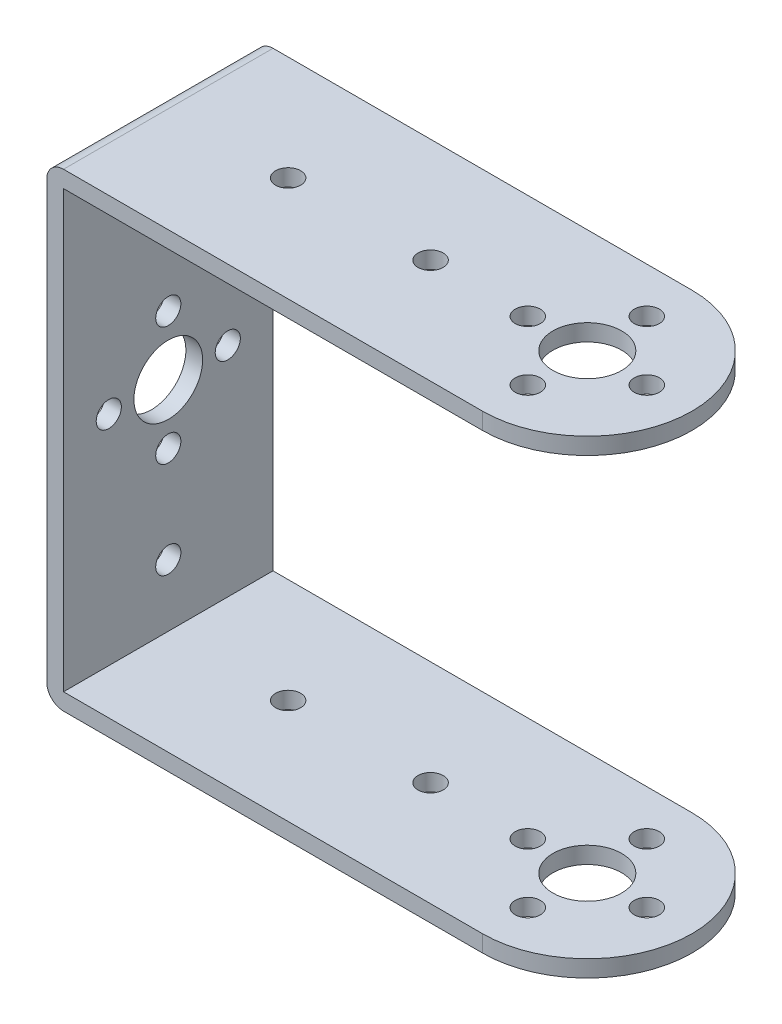
ISO-10303-21;
HEADER;
FILE_DESCRIPTION(('STEP AP214'),'2;1');
FILE_NAME('part.step','',(''),(''),'','','');
FILE_SCHEMA(('AUTOMOTIVE_DESIGN { 1 0 10303 214 1 1 1 1 }'));
ENDSEC;
DATA;
#1=APPLICATION_CONTEXT('core data for automotive mechanical design processes');
#2=APPLICATION_PROTOCOL_DEFINITION('international standard','automotive_design',2000,#1);
#3=PRODUCT_CONTEXT('',#1,'mechanical');
#4=PRODUCT('Part','Part','',(#3));
#5=PRODUCT_RELATED_PRODUCT_CATEGORY('part','',(#4));
#6=PRODUCT_DEFINITION_FORMATION('','',#4);
#7=PRODUCT_DEFINITION_CONTEXT('part definition',#1,'design');
#8=PRODUCT_DEFINITION('design','',#6,#7);
#9=PRODUCT_DEFINITION_SHAPE('','',#8);
#10=(LENGTH_UNIT() NAMED_UNIT(*) SI_UNIT(.MILLI.,.METRE.));
#11=(NAMED_UNIT(*) PLANE_ANGLE_UNIT() SI_UNIT($,.RADIAN.));
#12=(NAMED_UNIT(*) SI_UNIT($,.STERADIAN.) SOLID_ANGLE_UNIT());
#13=UNCERTAINTY_MEASURE_WITH_UNIT(LENGTH_MEASURE(1.E-05),#10,'distance_accuracy_value','');
#14=(GEOMETRIC_REPRESENTATION_CONTEXT(3) GLOBAL_UNCERTAINTY_ASSIGNED_CONTEXT((#13)) GLOBAL_UNIT_ASSIGNED_CONTEXT((#10,
#11,#12)) REPRESENTATION_CONTEXT('',''));
#15=CARTESIAN_POINT('',(0.,0.,0.));
#16=DIRECTION('',(0.,0.,1.));
#17=DIRECTION('',(1.,0.,0.));
#18=AXIS2_PLACEMENT_3D('',#15,#16,#17);
#19=CARTESIAN_POINT('',(-40.5,-56.,-12.5));
#20=DIRECTION('',(1.,0.,0.));
#21=DIRECTION('',(0.,0.,-1.));
#22=AXIS2_PLACEMENT_3D('',#19,#20,#21);
#23=PLANE('',#22);
#24=CARTESIAN_POINT('',(-40.5,-9.4,0.));
#25=DIRECTION('',(1.,0.,0.));
#26=DIRECTION('',(0.,0.,-1.));
#27=AXIS2_PLACEMENT_3D('',#24,#25,#26);
#28=CIRCLE('',#27,1.5);
#29=CARTESIAN_POINT('',(-40.5,-9.4,-1.5));
#30=VERTEX_POINT('',#29);
#31=EDGE_CURVE('E132',#30,#30,#28,.F.);
#32=ORIENTED_EDGE('',*,*,#31,.T.);
#33=EDGE_LOOP('',(#32));
#34=FACE_BOUND('',#33,.T.);
#35=CARTESIAN_POINT('',(-40.5,-35.1,0.));
#36=DIRECTION('',(1.,0.,0.));
#37=DIRECTION('',(0.,0.,-1.));
#38=AXIS2_PLACEMENT_3D('',#35,#36,#37);
#39=CIRCLE('',#38,1.50000000000002);
#40=CARTESIAN_POINT('',(-40.5,-35.1,-1.50000000000001));
#41=VERTEX_POINT('',#40);
#42=EDGE_CURVE('E158',#41,#41,#39,.F.);
#43=ORIENTED_EDGE('',*,*,#42,.T.);
#44=EDGE_LOOP('',(#43));
#45=FACE_BOUND('',#44,.T.);
#46=CARTESIAN_POINT('',(-40.5,-28.,7.1));
#47=DIRECTION('',(1.,0.,0.));
#48=DIRECTION('',(0.,0.,-1.));
#49=AXIS2_PLACEMENT_3D('',#46,#47,#48);
#50=CIRCLE('',#49,1.5);
#51=CARTESIAN_POINT('',(-40.5,-28.,5.6));
#52=VERTEX_POINT('',#51);
#53=EDGE_CURVE('E152',#52,#52,#50,.F.);
#54=ORIENTED_EDGE('',*,*,#53,.T.);
#55=EDGE_LOOP('',(#54));
#56=FACE_BOUND('',#55,.T.);
#57=CARTESIAN_POINT('',(-40.5,-20.9,0.));
#58=DIRECTION('',(1.,0.,0.));
#59=DIRECTION('',(0.,0.,-1.));
#60=AXIS2_PLACEMENT_3D('',#57,#58,#59);
#61=CIRCLE('',#60,1.50000000000001);
#62=CARTESIAN_POINT('',(-40.5,-20.9,-1.50000000000001));
#63=VERTEX_POINT('',#62);
#64=EDGE_CURVE('E151',#63,#63,#61,.F.);
#65=ORIENTED_EDGE('',*,*,#64,.T.);
#66=EDGE_LOOP('',(#65));
#67=FACE_BOUND('',#66,.T.);
#68=CARTESIAN_POINT('',(-40.5,-46.6,0.));
#69=DIRECTION('',(1.,0.,0.));
#70=DIRECTION('',(0.,0.,-1.));
#71=AXIS2_PLACEMENT_3D('',#68,#69,#70);
#72=CIRCLE('',#71,1.5);
#73=CARTESIAN_POINT('',(-40.5,-46.6,-1.50000000000001));
#74=VERTEX_POINT('',#73);
#75=EDGE_CURVE('E176',#74,#74,#72,.F.);
#76=ORIENTED_EDGE('',*,*,#75,.T.);
#77=EDGE_LOOP('',(#76));
#78=FACE_BOUND('',#77,.T.);
#79=CARTESIAN_POINT('',(-40.5,-28.,-7.1));
#80=DIRECTION('',(1.,0.,0.));
#81=DIRECTION('',(0.,0.,-1.));
#82=AXIS2_PLACEMENT_3D('',#79,#80,#81);
#83=CIRCLE('',#82,1.5);
#84=CARTESIAN_POINT('',(-40.5,-28.,-8.6));
#85=VERTEX_POINT('',#84);
#86=EDGE_CURVE('E170',#85,#85,#83,.F.);
#87=ORIENTED_EDGE('',*,*,#86,.T.);
#88=EDGE_LOOP('',(#87));
#89=FACE_BOUND('',#88,.T.);
#90=CARTESIAN_POINT('',(-40.5,-28.,0.));
#91=DIRECTION('',(1.,0.,0.));
#92=DIRECTION('',(0.,0.,-1.));
#93=AXIS2_PLACEMENT_3D('',#90,#91,#92);
#94=CIRCLE('',#93,4.1);
#95=CARTESIAN_POINT('',(-40.5,-28.,-4.1));
#96=VERTEX_POINT('',#95);
#97=EDGE_CURVE('E169',#96,#96,#94,.F.);
#98=ORIENTED_EDGE('',*,*,#97,.T.);
#99=EDGE_LOOP('',(#98));
#100=FACE_BOUND('',#99,.T.);
#101=DIRECTION('',(0.,1.,0.));
#102=VECTOR('',#101,1.);
#103=CARTESIAN_POINT('',(-40.5,-56.,12.5));
#104=LINE('',#103,#102);
#105=CARTESIAN_POINT('',(-40.5,-54.,12.5));
#106=VERTEX_POINT('',#105);
#107=CARTESIAN_POINT('',(-40.5,-2.,12.5));
#108=VERTEX_POINT('',#107);
#109=EDGE_CURVE('E189',#106,#108,#104,.T.);
#110=ORIENTED_EDGE('',*,*,#109,.F.);
#111=DIRECTION('',(0.,0.,-1.));
#112=VECTOR('',#111,1.);
#113=CARTESIAN_POINT('',(-40.5,-54.,0.));
#114=LINE('',#113,#112);
#115=CARTESIAN_POINT('',(-40.5,-54.,-12.5));
#116=VERTEX_POINT('',#115);
#117=EDGE_CURVE('E682',#106,#116,#114,.T.);
#118=ORIENTED_EDGE('',*,*,#117,.T.);
#119=DIRECTION('',(0.,1.,0.));
#120=VECTOR('',#119,1.);
#121=CARTESIAN_POINT('',(-40.5,-56.,-12.5));
#122=LINE('',#121,#120);
#123=CARTESIAN_POINT('',(-40.5,-2.,-12.5));
#124=VERTEX_POINT('',#123);
#125=EDGE_CURVE('E190',#116,#124,#122,.T.);
#126=ORIENTED_EDGE('',*,*,#125,.T.);
#127=DIRECTION('',(0.,0.,-1.));
#128=VECTOR('',#127,1.);
#129=CARTESIAN_POINT('',(-40.5,-2.,0.));
#130=LINE('',#129,#128);
#131=EDGE_CURVE('E192',#108,#124,#130,.T.);
#132=ORIENTED_EDGE('',*,*,#131,.F.);
#133=EDGE_LOOP('',(#110,#118,#126,#132));
#134=FACE_BOUND('',#133,.T.);
#135=ADVANCED_FACE('F37',(#34,#45,#56,#67,#78,#89,#100,#134),#23,.T.);
#136=CARTESIAN_POINT('',(9.5,-2.,0.));
#137=DIRECTION('',(0.,1.,0.));
#138=DIRECTION('',(0.,0.,1.));
#139=AXIS2_PLACEMENT_3D('',#136,#137,#138);
#140=CYLINDRICAL_SURFACE('',#139,12.5);
#141=DIRECTION('',(0.,1.,0.));
#142=VECTOR('',#141,1.);
#143=CARTESIAN_POINT('',(9.5,-2.,12.5));
#144=LINE('',#143,#142);
#145=CARTESIAN_POINT('',(9.5,-2.,12.5));
#146=VERTEX_POINT('',#145);
#147=CARTESIAN_POINT('',(9.5,0.,12.5));
#148=VERTEX_POINT('',#147);
#149=EDGE_CURVE('E251',#146,#148,#144,.T.);
#150=ORIENTED_EDGE('',*,*,#149,.F.);
#151=CARTESIAN_POINT('',(9.5,-2.,0.));
#152=DIRECTION('',(0.,1.,0.));
#153=DIRECTION('',(0.,0.,1.));
#154=AXIS2_PLACEMENT_3D('',#151,#152,#153);
#155=CIRCLE('',#154,12.5);
#156=CARTESIAN_POINT('',(9.49999999999999,-2.,-12.5));
#157=VERTEX_POINT('',#156);
#158=EDGE_CURVE('E259',#157,#146,#155,.F.);
#159=ORIENTED_EDGE('',*,*,#158,.F.);
#160=DIRECTION('',(0.,1.,0.));
#161=VECTOR('',#160,1.);
#162=CARTESIAN_POINT('',(9.5,-2.,-12.5));
#163=LINE('',#162,#161);
#164=CARTESIAN_POINT('',(9.49999999999999,0.,-12.5));
#165=VERTEX_POINT('',#164);
#166=EDGE_CURVE('E256',#165,#157,#163,.F.);
#167=ORIENTED_EDGE('',*,*,#166,.F.);
#168=CARTESIAN_POINT('',(9.5,0.,0.));
#169=DIRECTION('',(0.,1.,0.));
#170=DIRECTION('',(0.,0.,1.));
#171=AXIS2_PLACEMENT_3D('',#168,#169,#170);
#172=CIRCLE('',#171,12.5);
#173=EDGE_CURVE('E262',#148,#165,#172,.T.);
#174=ORIENTED_EDGE('',*,*,#173,.F.);
#175=EDGE_LOOP('',(#150,#159,#167,#174));
#176=FACE_BOUND('',#175,.T.);
#177=ADVANCED_FACE('F294',(#176),#140,.T.);
#178=CARTESIAN_POINT('',(22.,-2.,-12.5));
#179=DIRECTION('',(0.,0.,-1.));
#180=DIRECTION('',(-1.,0.,0.));
#181=AXIS2_PLACEMENT_3D('',#178,#179,#180);
#182=PLANE('',#181);
#183=DIRECTION('',(-1.,0.,0.));
#184=VECTOR('',#183,1.);
#185=CARTESIAN_POINT('',(-42.5,-56.,-12.5));
#186=LINE('',#185,#184);
#187=CARTESIAN_POINT('',(9.49999999999999,-56.,-12.5));
#188=VERTEX_POINT('',#187);
#189=CARTESIAN_POINT('',(-40.5,-56.,-12.5));
#190=VERTEX_POINT('',#189);
#191=EDGE_CURVE('E122',#188,#190,#186,.T.);
#192=ORIENTED_EDGE('',*,*,#191,.T.);
#193=CARTESIAN_POINT('',(-40.5,-54.,-12.5));
#194=DIRECTION('',(0.,0.,-1.));
#195=DIRECTION('',(-1.,0.,0.));
#196=AXIS2_PLACEMENT_3D('',#193,#194,#195);
#197=CIRCLE('',#196,2.);
#198=CARTESIAN_POINT('',(-42.5,-54.,-12.5));
#199=VERTEX_POINT('',#198);
#200=EDGE_CURVE('E45',#190,#199,#197,.T.);
#201=ORIENTED_EDGE('',*,*,#200,.T.);
#202=DIRECTION('',(0.,-1.,0.));
#203=VECTOR('',#202,1.);
#204=CARTESIAN_POINT('',(-42.5,0.,-12.5));
#205=LINE('',#204,#203);
#206=CARTESIAN_POINT('',(-42.5,-2.,-12.5));
#207=VERTEX_POINT('',#206);
#208=EDGE_CURVE('E205',#207,#199,#205,.T.);
#209=ORIENTED_EDGE('',*,*,#208,.F.);
#210=CARTESIAN_POINT('',(-40.5,-2.,-12.5));
#211=DIRECTION('',(0.,0.,-1.));
#212=DIRECTION('',(-1.,0.,0.));
#213=AXIS2_PLACEMENT_3D('',#210,#211,#212);
#214=CIRCLE('',#213,2.);
#215=CARTESIAN_POINT('',(-40.5,0.,-12.5));
#216=VERTEX_POINT('',#215);
#217=EDGE_CURVE('E52',#207,#216,#214,.T.);
#218=ORIENTED_EDGE('',*,*,#217,.T.);
#219=DIRECTION('',(-1.,0.,0.));
#220=VECTOR('',#219,1.);
#221=CARTESIAN_POINT('',(22.,0.,-12.5));
#222=LINE('',#221,#220);
#223=EDGE_CURVE('E248',#165,#216,#222,.T.);
#224=ORIENTED_EDGE('',*,*,#223,.F.);
#225=ORIENTED_EDGE('',*,*,#166,.T.);
#226=DIRECTION('',(-1.,0.,0.));
#227=VECTOR('',#226,1.);
#228=CARTESIAN_POINT('',(22.,-2.,-12.5));
#229=LINE('',#228,#227);
#230=EDGE_CURVE('E247',#157,#124,#229,.T.);
#231=ORIENTED_EDGE('',*,*,#230,.T.);
#232=ORIENTED_EDGE('',*,*,#125,.F.);
#233=DIRECTION('',(-1.,0.,0.));
#234=VECTOR('',#233,1.);
#235=CARTESIAN_POINT('',(22.,-54.,-12.5));
#236=LINE('',#235,#234);
#237=CARTESIAN_POINT('',(9.49999999999999,-54.,-12.5));
#238=VERTEX_POINT('',#237);
#239=EDGE_CURVE('E139',#238,#116,#236,.T.);
#240=ORIENTED_EDGE('',*,*,#239,.F.);
#241=DIRECTION('',(0.,-1.,0.));
#242=VECTOR('',#241,1.);
#243=CARTESIAN_POINT('',(9.5,-54.,-12.5));
#244=LINE('',#243,#242);
#245=EDGE_CURVE('E138',#188,#238,#244,.F.);
#246=ORIENTED_EDGE('',*,*,#245,.F.);
#247=EDGE_LOOP('',(#192,#201,#209,#218,#224,#225,#231,#232,#240,#246));
#248=FACE_BOUND('',#247,.T.);
#249=ADVANCED_FACE('F275',(#248),#182,.T.);
#250=CARTESIAN_POINT('',(22.,-2.,12.5));
#251=DIRECTION('',(0.,0.,1.));
#252=DIRECTION('',(1.,0.,0.));
#253=AXIS2_PLACEMENT_3D('',#250,#251,#252);
#254=PLANE('',#253);
#255=DIRECTION('',(0.,1.,0.));
#256=VECTOR('',#255,1.);
#257=CARTESIAN_POINT('',(-42.5,-2.,12.5));
#258=LINE('',#257,#256);
#259=CARTESIAN_POINT('',(-42.5,-54.,12.5));
#260=VERTEX_POINT('',#259);
#261=CARTESIAN_POINT('',(-42.5,-2.,12.5));
#262=VERTEX_POINT('',#261);
#263=EDGE_CURVE('E202',#260,#262,#258,.T.);
#264=ORIENTED_EDGE('',*,*,#263,.F.);
#265=CARTESIAN_POINT('',(-40.5,-54.,12.5));
#266=DIRECTION('',(0.,0.,1.));
#267=DIRECTION('',(1.,0.,0.));
#268=AXIS2_PLACEMENT_3D('',#265,#266,#267);
#269=CIRCLE('',#268,2.);
#270=CARTESIAN_POINT('',(-40.5,-56.,12.5));
#271=VERTEX_POINT('',#270);
#272=EDGE_CURVE('E121',#260,#271,#269,.T.);
#273=ORIENTED_EDGE('',*,*,#272,.T.);
#274=DIRECTION('',(1.,0.,0.));
#275=VECTOR('',#274,1.);
#276=CARTESIAN_POINT('',(-42.5,-56.,12.5));
#277=LINE('',#276,#275);
#278=CARTESIAN_POINT('',(9.5,-56.,12.5));
#279=VERTEX_POINT('',#278);
#280=EDGE_CURVE('E114',#271,#279,#277,.T.);
#281=ORIENTED_EDGE('',*,*,#280,.T.);
#282=DIRECTION('',(0.,-1.,0.));
#283=VECTOR('',#282,1.);
#284=CARTESIAN_POINT('',(9.5,-54.,12.5));
#285=LINE('',#284,#283);
#286=CARTESIAN_POINT('',(9.5,-54.,12.5));
#287=VERTEX_POINT('',#286);
#288=EDGE_CURVE('E120',#287,#279,#285,.T.);
#289=ORIENTED_EDGE('',*,*,#288,.F.);
#290=DIRECTION('',(1.,0.,0.));
#291=VECTOR('',#290,1.);
#292=CARTESIAN_POINT('',(22.,-54.,12.5));
#293=LINE('',#292,#291);
#294=EDGE_CURVE('E143',#106,#287,#293,.T.);
#295=ORIENTED_EDGE('',*,*,#294,.F.);
#296=ORIENTED_EDGE('',*,*,#109,.T.);
#297=DIRECTION('',(1.,0.,0.));
#298=VECTOR('',#297,1.);
#299=CARTESIAN_POINT('',(22.,-2.,12.5));
#300=LINE('',#299,#298);
#301=EDGE_CURVE('E245',#108,#146,#300,.T.);
#302=ORIENTED_EDGE('',*,*,#301,.T.);
#303=ORIENTED_EDGE('',*,*,#149,.T.);
#304=DIRECTION('',(1.,0.,0.));
#305=VECTOR('',#304,1.);
#306=CARTESIAN_POINT('',(22.,0.,12.5));
#307=LINE('',#306,#305);
#308=CARTESIAN_POINT('',(-40.5,0.,12.5));
#309=VERTEX_POINT('',#308);
#310=EDGE_CURVE('E244',#309,#148,#307,.T.);
#311=ORIENTED_EDGE('',*,*,#310,.F.);
#312=CARTESIAN_POINT('',(-40.5,-2.,12.5));
#313=DIRECTION('',(0.,0.,1.));
#314=DIRECTION('',(1.,0.,0.));
#315=AXIS2_PLACEMENT_3D('',#312,#313,#314);
#316=CIRCLE('',#315,2.);
#317=EDGE_CURVE('E270',#309,#262,#316,.T.);
#318=ORIENTED_EDGE('',*,*,#317,.T.);
#319=EDGE_LOOP('',(#264,#273,#281,#289,#295,#296,#302,#303,#311,#318));
#320=FACE_BOUND('',#319,.T.);
#321=ADVANCED_FACE('F117',(#320),#254,.T.);
#322=CARTESIAN_POINT('',(0.,-2.,0.));
#323=DIRECTION('',(0.,1.,0.));
#324=DIRECTION('',(0.,0.,1.));
#325=AXIS2_PLACEMENT_3D('',#322,#323,#324);
#326=PLANE('',#325);
#327=CARTESIAN_POINT('',(-26.2,-2.,0.));
#328=DIRECTION('',(0.,1.,0.));
#329=DIRECTION('',(0.,0.,1.));
#330=AXIS2_PLACEMENT_3D('',#327,#328,#329);
#331=CIRCLE('',#330,1.5);
#332=CARTESIAN_POINT('',(-26.2,-2.,1.5));
#333=VERTEX_POINT('',#332);
#334=EDGE_CURVE('E199',#333,#333,#331,.F.);
#335=ORIENTED_EDGE('',*,*,#334,.F.);
#336=EDGE_LOOP('',(#335));
#337=FACE_BOUND('',#336,.T.);
#338=CARTESIAN_POINT('',(-9.2,-2.,0.));
#339=DIRECTION('',(0.,1.,0.));
#340=DIRECTION('',(0.,0.,1.));
#341=AXIS2_PLACEMENT_3D('',#338,#339,#340);
#342=CIRCLE('',#341,1.5);
#343=CARTESIAN_POINT('',(-9.2,-2.,1.5));
#344=VERTEX_POINT('',#343);
#345=EDGE_CURVE('E220',#344,#344,#342,.F.);
#346=ORIENTED_EDGE('',*,*,#345,.F.);
#347=EDGE_LOOP('',(#346));
#348=FACE_BOUND('',#347,.T.);
#349=CARTESIAN_POINT('',(9.5,-2.,7.1));
#350=DIRECTION('',(0.,1.,0.));
#351=DIRECTION('',(0.,0.,1.));
#352=AXIS2_PLACEMENT_3D('',#349,#350,#351);
#353=CIRCLE('',#352,1.5);
#354=CARTESIAN_POINT('',(9.5,-2.,8.6));
#355=VERTEX_POINT('',#354);
#356=EDGE_CURVE('E213',#355,#355,#353,.F.);
#357=ORIENTED_EDGE('',*,*,#356,.F.);
#358=EDGE_LOOP('',(#357));
#359=FACE_BOUND('',#358,.T.);
#360=CARTESIAN_POINT('',(16.6,-2.,0.));
#361=DIRECTION('',(0.,1.,0.));
#362=DIRECTION('',(0.,0.,1.));
#363=AXIS2_PLACEMENT_3D('',#360,#361,#362);
#364=CIRCLE('',#363,1.5);
#365=CARTESIAN_POINT('',(16.6,-2.,1.5));
#366=VERTEX_POINT('',#365);
#367=EDGE_CURVE('E212',#366,#366,#364,.F.);
#368=ORIENTED_EDGE('',*,*,#367,.F.);
#369=EDGE_LOOP('',(#368));
#370=FACE_BOUND('',#369,.T.);
#371=CARTESIAN_POINT('',(9.5,-2.,-7.1));
#372=DIRECTION('',(0.,1.,0.));
#373=DIRECTION('',(0.,0.,1.));
#374=AXIS2_PLACEMENT_3D('',#371,#372,#373);
#375=CIRCLE('',#374,1.5);
#376=CARTESIAN_POINT('',(9.5,-2.,-5.6));
#377=VERTEX_POINT('',#376);
#378=EDGE_CURVE('E231',#377,#377,#375,.F.);
#379=ORIENTED_EDGE('',*,*,#378,.F.);
#380=EDGE_LOOP('',(#379));
#381=FACE_BOUND('',#380,.T.);
#382=CARTESIAN_POINT('',(2.4,-2.,0.));
#383=DIRECTION('',(0.,1.,0.));
#384=DIRECTION('',(0.,0.,1.));
#385=AXIS2_PLACEMENT_3D('',#382,#383,#384);
#386=CIRCLE('',#385,1.5);
#387=CARTESIAN_POINT('',(2.4,-2.,1.5));
#388=VERTEX_POINT('',#387);
#389=EDGE_CURVE('E230',#388,#388,#386,.F.);
#390=ORIENTED_EDGE('',*,*,#389,.F.);
#391=EDGE_LOOP('',(#390));
#392=FACE_BOUND('',#391,.T.);
#393=CARTESIAN_POINT('',(9.5,-2.,0.));
#394=DIRECTION('',(0.,1.,0.));
#395=DIRECTION('',(0.,0.,1.));
#396=AXIS2_PLACEMENT_3D('',#393,#394,#395);
#397=CIRCLE('',#396,4.1);
#398=CARTESIAN_POINT('',(9.5,-2.,4.1));
#399=VERTEX_POINT('',#398);
#400=EDGE_CURVE('E241',#399,#399,#397,.F.);
#401=ORIENTED_EDGE('',*,*,#400,.F.);
#402=EDGE_LOOP('',(#401));
#403=FACE_BOUND('',#402,.T.);
#404=ORIENTED_EDGE('',*,*,#301,.F.);
#405=ORIENTED_EDGE('',*,*,#131,.T.);
#406=ORIENTED_EDGE('',*,*,#230,.F.);
#407=ORIENTED_EDGE('',*,*,#158,.T.);
#408=EDGE_LOOP('',(#404,#405,#406,#407));
#409=FACE_BOUND('',#408,.T.);
#410=ADVANCED_FACE('F337',(#337,#348,#359,#370,#381,#392,#403,#409),#326,.F.);
#411=CARTESIAN_POINT('',(0.,0.,0.));
#412=DIRECTION('',(0.,1.,0.));
#413=DIRECTION('',(0.,0.,1.));
#414=AXIS2_PLACEMENT_3D('',#411,#412,#413);
#415=PLANE('',#414);
#416=ORIENTED_EDGE('',*,*,#223,.T.);
#417=DIRECTION('',(0.,0.,-1.));
#418=VECTOR('',#417,1.);
#419=CARTESIAN_POINT('',(-40.5,0.,0.));
#420=LINE('',#419,#418);
#421=EDGE_CURVE('E11',#216,#309,#420,.F.);
#422=ORIENTED_EDGE('',*,*,#421,.T.);
#423=ORIENTED_EDGE('',*,*,#310,.T.);
#424=ORIENTED_EDGE('',*,*,#173,.T.);
#425=EDGE_LOOP('',(#416,#422,#423,#424));
#426=FACE_BOUND('',#425,.T.);
#427=CARTESIAN_POINT('',(-26.2,0.,0.));
#428=DIRECTION('',(0.,1.,0.));
#429=DIRECTION('',(0.,0.,1.));
#430=AXIS2_PLACEMENT_3D('',#427,#428,#429);
#431=CIRCLE('',#430,1.5);
#432=CARTESIAN_POINT('',(-26.2,0.,1.5));
#433=VERTEX_POINT('',#432);
#434=EDGE_CURVE('E196',#433,#433,#431,.T.);
#435=ORIENTED_EDGE('',*,*,#434,.F.);
#436=EDGE_LOOP('',(#435));
#437=FACE_BOUND('',#436,.T.);
#438=CARTESIAN_POINT('',(-9.2,0.,0.));
#439=DIRECTION('',(0.,1.,0.));
#440=DIRECTION('',(0.,0.,1.));
#441=AXIS2_PLACEMENT_3D('',#438,#439,#440);
#442=CIRCLE('',#441,1.5);
#443=CARTESIAN_POINT('',(-9.2,0.,1.5));
#444=VERTEX_POINT('',#443);
#445=EDGE_CURVE('E208',#444,#444,#442,.T.);
#446=ORIENTED_EDGE('',*,*,#445,.F.);
#447=EDGE_LOOP('',(#446));
#448=FACE_BOUND('',#447,.T.);
#449=CARTESIAN_POINT('',(9.5,0.,7.1));
#450=DIRECTION('',(0.,1.,0.));
#451=DIRECTION('',(0.,0.,1.));
#452=AXIS2_PLACEMENT_3D('',#449,#450,#451);
#453=CIRCLE('',#452,1.5);
#454=CARTESIAN_POINT('',(9.5,0.,8.6));
#455=VERTEX_POINT('',#454);
#456=EDGE_CURVE('E217',#455,#455,#453,.T.);
#457=ORIENTED_EDGE('',*,*,#456,.F.);
#458=EDGE_LOOP('',(#457));
#459=FACE_BOUND('',#458,.T.);
#460=CARTESIAN_POINT('',(16.6,0.,0.));
#461=DIRECTION('',(0.,1.,0.));
#462=DIRECTION('',(0.,0.,1.));
#463=AXIS2_PLACEMENT_3D('',#460,#461,#462);
#464=CIRCLE('',#463,1.5);
#465=CARTESIAN_POINT('',(16.6,0.,1.5));
#466=VERTEX_POINT('',#465);
#467=EDGE_CURVE('E209',#466,#466,#464,.T.);
#468=ORIENTED_EDGE('',*,*,#467,.F.);
#469=EDGE_LOOP('',(#468));
#470=FACE_BOUND('',#469,.T.);
#471=CARTESIAN_POINT('',(9.5,0.,-7.1));
#472=DIRECTION('',(0.,1.,0.));
#473=DIRECTION('',(0.,0.,1.));
#474=AXIS2_PLACEMENT_3D('',#471,#472,#473);
#475=CIRCLE('',#474,1.5);
#476=CARTESIAN_POINT('',(9.5,0.,-5.6));
#477=VERTEX_POINT('',#476);
#478=EDGE_CURVE('E216',#477,#477,#475,.T.);
#479=ORIENTED_EDGE('',*,*,#478,.F.);
#480=EDGE_LOOP('',(#479));
#481=FACE_BOUND('',#480,.T.);
#482=CARTESIAN_POINT('',(2.4,0.,0.));
#483=DIRECTION('',(0.,1.,0.));
#484=DIRECTION('',(0.,0.,1.));
#485=AXIS2_PLACEMENT_3D('',#482,#483,#484);
#486=CIRCLE('',#485,1.5);
#487=CARTESIAN_POINT('',(2.4,0.,1.5));
#488=VERTEX_POINT('',#487);
#489=EDGE_CURVE('E227',#488,#488,#486,.T.);
#490=ORIENTED_EDGE('',*,*,#489,.F.);
#491=EDGE_LOOP('',(#490));
#492=FACE_BOUND('',#491,.T.);
#493=CARTESIAN_POINT('',(9.5,0.,0.));
#494=DIRECTION('',(0.,1.,0.));
#495=DIRECTION('',(0.,0.,1.));
#496=AXIS2_PLACEMENT_3D('',#493,#494,#495);
#497=CIRCLE('',#496,4.1);
#498=CARTESIAN_POINT('',(9.5,0.,4.1));
#499=VERTEX_POINT('',#498);
#500=EDGE_CURVE('E234',#499,#499,#497,.T.);
#501=ORIENTED_EDGE('',*,*,#500,.F.);
#502=EDGE_LOOP('',(#501));
#503=FACE_BOUND('',#502,.T.);
#504=ADVANCED_FACE('F335',(#426,#437,#448,#459,#470,#481,#492,#503),#415,.T.);
#505=CARTESIAN_POINT('',(9.5,-2.001,0.));
#506=DIRECTION('',(0.,1.,0.));
#507=DIRECTION('',(0.,0.,1.));
#508=AXIS2_PLACEMENT_3D('',#505,#506,#507);
#509=CYLINDRICAL_SURFACE('',#508,4.1);
#510=ORIENTED_EDGE('',*,*,#500,.T.);
#511=EDGE_LOOP('',(#510));
#512=FACE_BOUND('',#511,.T.);
#513=ORIENTED_EDGE('',*,*,#400,.T.);
#514=EDGE_LOOP('',(#513));
#515=FACE_BOUND('',#514,.T.);
#516=ADVANCED_FACE('F328',(#512,#515),#509,.F.);
#517=CARTESIAN_POINT('',(2.4,-2.001,0.));
#518=DIRECTION('',(0.,1.,0.));
#519=DIRECTION('',(0.,0.,1.));
#520=AXIS2_PLACEMENT_3D('',#517,#518,#519);
#521=CYLINDRICAL_SURFACE('',#520,1.5);
#522=ORIENTED_EDGE('',*,*,#489,.T.);
#523=EDGE_LOOP('',(#522));
#524=FACE_BOUND('',#523,.T.);
#525=ORIENTED_EDGE('',*,*,#389,.T.);
#526=EDGE_LOOP('',(#525));
#527=FACE_BOUND('',#526,.T.);
#528=ADVANCED_FACE('F325',(#524,#527),#521,.F.);
#529=CARTESIAN_POINT('',(9.5,-2.001,-7.1));
#530=DIRECTION('',(0.,1.,0.));
#531=DIRECTION('',(0.,0.,1.));
#532=AXIS2_PLACEMENT_3D('',#529,#530,#531);
#533=CYLINDRICAL_SURFACE('',#532,1.5);
#534=ORIENTED_EDGE('',*,*,#478,.T.);
#535=EDGE_LOOP('',(#534));
#536=FACE_BOUND('',#535,.T.);
#537=ORIENTED_EDGE('',*,*,#378,.T.);
#538=EDGE_LOOP('',(#537));
#539=FACE_BOUND('',#538,.T.);
#540=ADVANCED_FACE('F317',(#536,#539),#533,.F.);
#541=CARTESIAN_POINT('',(16.6,-2.001,0.));
#542=DIRECTION('',(0.,1.,0.));
#543=DIRECTION('',(0.,0.,1.));
#544=AXIS2_PLACEMENT_3D('',#541,#542,#543);
#545=CYLINDRICAL_SURFACE('',#544,1.5);
#546=ORIENTED_EDGE('',*,*,#467,.T.);
#547=EDGE_LOOP('',(#546));
#548=FACE_BOUND('',#547,.T.);
#549=ORIENTED_EDGE('',*,*,#367,.T.);
#550=EDGE_LOOP('',(#549));
#551=FACE_BOUND('',#550,.T.);
#552=ADVANCED_FACE('F313',(#548,#551),#545,.F.);
#553=CARTESIAN_POINT('',(9.5,-2.001,7.1));
#554=DIRECTION('',(0.,1.,0.));
#555=DIRECTION('',(0.,0.,1.));
#556=AXIS2_PLACEMENT_3D('',#553,#554,#555);
#557=CYLINDRICAL_SURFACE('',#556,1.5);
#558=ORIENTED_EDGE('',*,*,#456,.T.);
#559=EDGE_LOOP('',(#558));
#560=FACE_BOUND('',#559,.T.);
#561=ORIENTED_EDGE('',*,*,#356,.T.);
#562=EDGE_LOOP('',(#561));
#563=FACE_BOUND('',#562,.T.);
#564=ADVANCED_FACE('F316',(#560,#563),#557,.F.);
#565=CARTESIAN_POINT('',(-9.2,-2.001,0.));
#566=DIRECTION('',(0.,1.,0.));
#567=DIRECTION('',(0.,0.,1.));
#568=AXIS2_PLACEMENT_3D('',#565,#566,#567);
#569=CYLINDRICAL_SURFACE('',#568,1.5);
#570=ORIENTED_EDGE('',*,*,#445,.T.);
#571=EDGE_LOOP('',(#570));
#572=FACE_BOUND('',#571,.T.);
#573=ORIENTED_EDGE('',*,*,#345,.T.);
#574=EDGE_LOOP('',(#573));
#575=FACE_BOUND('',#574,.T.);
#576=ADVANCED_FACE('F311',(#572,#575),#569,.F.);
#577=CARTESIAN_POINT('',(-42.5,0.,0.));
#578=DIRECTION('',(-1.,0.,0.));
#579=DIRECTION('',(0.,0.,1.));
#580=AXIS2_PLACEMENT_3D('',#577,#578,#579);
#581=PLANE('',#580);
#582=CARTESIAN_POINT('',(-42.5,-9.4,0.));
#583=DIRECTION('',(-1.,0.,0.));
#584=DIRECTION('',(0.,0.,1.));
#585=AXIS2_PLACEMENT_3D('',#582,#583,#584);
#586=CIRCLE('',#585,1.5);
#587=CARTESIAN_POINT('',(-42.5,-9.4,1.5));
#588=VERTEX_POINT('',#587);
#589=EDGE_CURVE('E161',#588,#588,#586,.T.);
#590=ORIENTED_EDGE('',*,*,#589,.F.);
#591=EDGE_LOOP('',(#590));
#592=FACE_BOUND('',#591,.T.);
#593=CARTESIAN_POINT('',(-42.5,-35.1,0.));
#594=DIRECTION('',(-1.,0.,0.));
#595=DIRECTION('',(0.,0.,1.));
#596=AXIS2_PLACEMENT_3D('',#593,#594,#595);
#597=CIRCLE('',#596,1.50000000000002);
#598=CARTESIAN_POINT('',(-42.5,-35.1,1.50000000000002));
#599=VERTEX_POINT('',#598);
#600=EDGE_CURVE('E155',#599,#599,#597,.T.);
#601=ORIENTED_EDGE('',*,*,#600,.F.);
#602=EDGE_LOOP('',(#601));
#603=FACE_BOUND('',#602,.T.);
#604=CARTESIAN_POINT('',(-42.5,-28.,7.1));
#605=DIRECTION('',(-1.,0.,0.));
#606=DIRECTION('',(0.,0.,1.));
#607=AXIS2_PLACEMENT_3D('',#604,#605,#606);
#608=CIRCLE('',#607,1.5);
#609=CARTESIAN_POINT('',(-42.5,-28.,8.6));
#610=VERTEX_POINT('',#609);
#611=EDGE_CURVE('E148',#610,#610,#608,.T.);
#612=ORIENTED_EDGE('',*,*,#611,.F.);
#613=EDGE_LOOP('',(#612));
#614=FACE_BOUND('',#613,.T.);
#615=CARTESIAN_POINT('',(-42.5,-20.9,0.));
#616=DIRECTION('',(-1.,0.,0.));
#617=DIRECTION('',(0.,0.,1.));
#618=AXIS2_PLACEMENT_3D('',#615,#616,#617);
#619=CIRCLE('',#618,1.50000000000001);
#620=CARTESIAN_POINT('',(-42.5,-20.9,1.50000000000001));
#621=VERTEX_POINT('',#620);
#622=EDGE_CURVE('E179',#621,#621,#619,.T.);
#623=ORIENTED_EDGE('',*,*,#622,.F.);
#624=EDGE_LOOP('',(#623));
#625=FACE_BOUND('',#624,.T.);
#626=CARTESIAN_POINT('',(-42.5,-46.6,0.));
#627=DIRECTION('',(-1.,0.,0.));
#628=DIRECTION('',(0.,0.,-1.));
#629=AXIS2_PLACEMENT_3D('',#626,#627,#628);
#630=CIRCLE('',#629,1.5);
#631=CARTESIAN_POINT('',(-42.5,-46.6,-1.50000000000001));
#632=VERTEX_POINT('',#631);
#633=EDGE_CURVE('E173',#632,#632,#630,.T.);
#634=ORIENTED_EDGE('',*,*,#633,.F.);
#635=EDGE_LOOP('',(#634));
#636=FACE_BOUND('',#635,.T.);
#637=CARTESIAN_POINT('',(-42.5,-28.,-7.1));
#638=DIRECTION('',(-1.,0.,0.));
#639=DIRECTION('',(0.,0.,1.));
#640=AXIS2_PLACEMENT_3D('',#637,#638,#639);
#641=CIRCLE('',#640,1.5);
#642=CARTESIAN_POINT('',(-42.5,-28.,-5.6));
#643=VERTEX_POINT('',#642);
#644=EDGE_CURVE('E166',#643,#643,#641,.T.);
#645=ORIENTED_EDGE('',*,*,#644,.F.);
#646=EDGE_LOOP('',(#645));
#647=FACE_BOUND('',#646,.T.);
#648=CARTESIAN_POINT('',(-42.5,-28.,0.));
#649=DIRECTION('',(-1.,0.,0.));
#650=DIRECTION('',(0.,0.,1.));
#651=AXIS2_PLACEMENT_3D('',#648,#649,#650);
#652=CIRCLE('',#651,4.1);
#653=CARTESIAN_POINT('',(-42.5,-28.,4.1));
#654=VERTEX_POINT('',#653);
#655=EDGE_CURVE('E123',#654,#654,#652,.T.);
#656=ORIENTED_EDGE('',*,*,#655,.F.);
#657=EDGE_LOOP('',(#656));
#658=FACE_BOUND('',#657,.T.);
#659=ORIENTED_EDGE('',*,*,#208,.T.);
#660=DIRECTION('',(0.,0.,1.));
#661=VECTOR('',#660,1.);
#662=CARTESIAN_POINT('',(-42.5,-54.,12.5));
#663=LINE('',#662,#661);
#664=EDGE_CURVE('E267',#199,#260,#663,.T.);
#665=ORIENTED_EDGE('',*,*,#664,.T.);
#666=ORIENTED_EDGE('',*,*,#263,.T.);
#667=DIRECTION('',(0.,0.,-1.));
#668=VECTOR('',#667,1.);
#669=CARTESIAN_POINT('',(-42.5,-2.,0.));
#670=LINE('',#669,#668);
#671=EDGE_CURVE('E264',#262,#207,#670,.T.);
#672=ORIENTED_EDGE('',*,*,#671,.T.);
#673=EDGE_LOOP('',(#659,#665,#666,#672));
#674=FACE_BOUND('',#673,.T.);
#675=ADVANCED_FACE('F279',(#592,#603,#614,#625,#636,#647,#658,#674),#581,.T.);
#676=CARTESIAN_POINT('',(-26.2,-2.001,0.));
#677=DIRECTION('',(0.,1.,0.));
#678=DIRECTION('',(0.,0.,1.));
#679=AXIS2_PLACEMENT_3D('',#676,#677,#678);
#680=CYLINDRICAL_SURFACE('',#679,1.5);
#681=ORIENTED_EDGE('',*,*,#434,.T.);
#682=EDGE_LOOP('',(#681));
#683=FACE_BOUND('',#682,.T.);
#684=ORIENTED_EDGE('',*,*,#334,.T.);
#685=EDGE_LOOP('',(#684));
#686=FACE_BOUND('',#685,.T.);
#687=ADVANCED_FACE('F305',(#683,#686),#680,.F.);
#688=CARTESIAN_POINT('',(0.,-56.,0.));
#689=DIRECTION('',(0.,1.,0.));
#690=DIRECTION('',(0.,0.,1.));
#691=AXIS2_PLACEMENT_3D('',#688,#689,#690);
#692=PLANE('',#691);
#693=ORIENTED_EDGE('',*,*,#280,.F.);
#694=DIRECTION('',(0.,0.,1.));
#695=VECTOR('',#694,1.);
#696=CARTESIAN_POINT('',(-40.5,-56.,-12.5));
#697=LINE('',#696,#695);
#698=EDGE_CURVE('E60',#271,#190,#697,.F.);
#699=ORIENTED_EDGE('',*,*,#698,.T.);
#700=ORIENTED_EDGE('',*,*,#191,.F.);
#701=CARTESIAN_POINT('',(9.5,-56.,0.));
#702=DIRECTION('',(0.,1.,0.));
#703=DIRECTION('',(0.,0.,1.));
#704=AXIS2_PLACEMENT_3D('',#701,#702,#703);
#705=CIRCLE('',#704,12.5);
#706=EDGE_CURVE('E126',#279,#188,#705,.T.);
#707=ORIENTED_EDGE('',*,*,#706,.F.);
#708=EDGE_LOOP('',(#693,#699,#700,#707));
#709=FACE_BOUND('',#708,.T.);
#710=CARTESIAN_POINT('',(-26.2,-56.,0.));
#711=DIRECTION('',(0.,1.,0.));
#712=DIRECTION('',(0.,0.,1.));
#713=AXIS2_PLACEMENT_3D('',#710,#711,#712);
#714=CIRCLE('',#713,1.5);
#715=CARTESIAN_POINT('',(-26.2,-56.,1.5));
#716=VERTEX_POINT('',#715);
#717=EDGE_CURVE('E729',#716,#716,#714,.T.);
#718=ORIENTED_EDGE('',*,*,#717,.T.);
#719=EDGE_LOOP('',(#718));
#720=FACE_BOUND('',#719,.T.);
#721=CARTESIAN_POINT('',(-9.2,-56.,0.));
#722=DIRECTION('',(0.,1.,0.));
#723=DIRECTION('',(0.,0.,1.));
#724=AXIS2_PLACEMENT_3D('',#721,#722,#723);
#725=CIRCLE('',#724,1.5);
#726=CARTESIAN_POINT('',(-9.2,-56.,1.5));
#727=VERTEX_POINT('',#726);
#728=EDGE_CURVE('E648',#727,#727,#725,.T.);
#729=ORIENTED_EDGE('',*,*,#728,.T.);
#730=EDGE_LOOP('',(#729));
#731=FACE_BOUND('',#730,.T.);
#732=CARTESIAN_POINT('',(9.5,-56.,7.1));
#733=DIRECTION('',(0.,1.,0.));
#734=DIRECTION('',(0.,0.,1.));
#735=AXIS2_PLACEMENT_3D('',#732,#733,#734);
#736=CIRCLE('',#735,1.5);
#737=CARTESIAN_POINT('',(9.5,-56.,8.6));
#738=VERTEX_POINT('',#737);
#739=EDGE_CURVE('E653',#738,#738,#736,.T.);
#740=ORIENTED_EDGE('',*,*,#739,.T.);
#741=EDGE_LOOP('',(#740));
#742=FACE_BOUND('',#741,.T.);
#743=CARTESIAN_POINT('',(16.6,-56.,0.));
#744=DIRECTION('',(0.,1.,0.));
#745=DIRECTION('',(0.,0.,1.));
#746=AXIS2_PLACEMENT_3D('',#743,#744,#745);
#747=CIRCLE('',#746,1.5);
#748=CARTESIAN_POINT('',(16.6,-56.,1.5));
#749=VERTEX_POINT('',#748);
#750=EDGE_CURVE('E736',#749,#749,#747,.T.);
#751=ORIENTED_EDGE('',*,*,#750,.T.);
#752=EDGE_LOOP('',(#751));
#753=FACE_BOUND('',#752,.T.);
#754=CARTESIAN_POINT('',(9.5,-56.,-7.1));
#755=DIRECTION('',(0.,1.,0.));
#756=DIRECTION('',(0.,0.,1.));
#757=AXIS2_PLACEMENT_3D('',#754,#755,#756);
#758=CIRCLE('',#757,1.5);
#759=CARTESIAN_POINT('',(9.5,-56.,-5.6));
#760=VERTEX_POINT('',#759);
#761=EDGE_CURVE('E670',#760,#760,#758,.T.);
#762=ORIENTED_EDGE('',*,*,#761,.T.);
#763=EDGE_LOOP('',(#762));
#764=FACE_BOUND('',#763,.T.);
#765=CARTESIAN_POINT('',(2.4,-56.,0.));
#766=DIRECTION('',(0.,1.,0.));
#767=DIRECTION('',(0.,0.,1.));
#768=AXIS2_PLACEMENT_3D('',#765,#766,#767);
#769=CIRCLE('',#768,1.5);
#770=CARTESIAN_POINT('',(2.4,-56.,1.5));
#771=VERTEX_POINT('',#770);
#772=EDGE_CURVE('E662',#771,#771,#769,.T.);
#773=ORIENTED_EDGE('',*,*,#772,.T.);
#774=EDGE_LOOP('',(#773));
#775=FACE_BOUND('',#774,.T.);
#776=CARTESIAN_POINT('',(9.5,-56.,0.));
#777=DIRECTION('',(0.,1.,0.));
#778=DIRECTION('',(0.,0.,1.));
#779=AXIS2_PLACEMENT_3D('',#776,#777,#778);
#780=CIRCLE('',#779,4.1);
#781=CARTESIAN_POINT('',(9.5,-56.,4.1));
#782=VERTEX_POINT('',#781);
#783=EDGE_CURVE('E669',#782,#782,#780,.T.);
#784=ORIENTED_EDGE('',*,*,#783,.T.);
#785=EDGE_LOOP('',(#784));
#786=FACE_BOUND('',#785,.T.);
#787=ADVANCED_FACE('F127',(#709,#720,#731,#742,#753,#764,#775,#786),#692,.F.);
#788=CARTESIAN_POINT('',(22.001,-28.,0.));
#789=DIRECTION('',(-1.,0.,0.));
#790=DIRECTION('',(0.,0.,1.));
#791=AXIS2_PLACEMENT_3D('',#788,#789,#790);
#792=CYLINDRICAL_SURFACE('',#791,4.1);
#793=ORIENTED_EDGE('',*,*,#97,.F.);
#794=EDGE_LOOP('',(#793));
#795=FACE_BOUND('',#794,.T.);
#796=ORIENTED_EDGE('',*,*,#655,.T.);
#797=EDGE_LOOP('',(#796));
#798=FACE_BOUND('',#797,.T.);
#799=ADVANCED_FACE('F411',(#795,#798),#792,.F.);
#800=CARTESIAN_POINT('',(22.001,-28.,-7.1));
#801=DIRECTION('',(-1.,0.,0.));
#802=DIRECTION('',(0.,0.,1.));
#803=AXIS2_PLACEMENT_3D('',#800,#801,#802);
#804=CYLINDRICAL_SURFACE('',#803,1.5);
#805=ORIENTED_EDGE('',*,*,#86,.F.);
#806=EDGE_LOOP('',(#805));
#807=FACE_BOUND('',#806,.T.);
#808=ORIENTED_EDGE('',*,*,#644,.T.);
#809=EDGE_LOOP('',(#808));
#810=FACE_BOUND('',#809,.T.);
#811=ADVANCED_FACE('F417',(#807,#810),#804,.F.);
#812=CARTESIAN_POINT('',(22.001,-46.6,0.));
#813=DIRECTION('',(-1.,0.,0.));
#814=DIRECTION('',(0.,0.,1.));
#815=AXIS2_PLACEMENT_3D('',#812,#813,#814);
#816=CYLINDRICAL_SURFACE('',#815,1.5);
#817=ORIENTED_EDGE('',*,*,#75,.F.);
#818=EDGE_LOOP('',(#817));
#819=FACE_BOUND('',#818,.T.);
#820=ORIENTED_EDGE('',*,*,#633,.T.);
#821=EDGE_LOOP('',(#820));
#822=FACE_BOUND('',#821,.T.);
#823=ADVANCED_FACE('F425',(#819,#822),#816,.F.);
#824=CARTESIAN_POINT('',(22.001,-20.9,0.));
#825=DIRECTION('',(-1.,0.,0.));
#826=DIRECTION('',(0.,0.,1.));
#827=AXIS2_PLACEMENT_3D('',#824,#825,#826);
#828=CYLINDRICAL_SURFACE('',#827,1.50000000000001);
#829=ORIENTED_EDGE('',*,*,#64,.F.);
#830=EDGE_LOOP('',(#829));
#831=FACE_BOUND('',#830,.T.);
#832=ORIENTED_EDGE('',*,*,#622,.T.);
#833=EDGE_LOOP('',(#832));
#834=FACE_BOUND('',#833,.T.);
#835=ADVANCED_FACE('F435',(#831,#834),#828,.F.);
#836=CARTESIAN_POINT('',(22.001,-28.,7.1));
#837=DIRECTION('',(-1.,0.,0.));
#838=DIRECTION('',(0.,0.,1.));
#839=AXIS2_PLACEMENT_3D('',#836,#837,#838);
#840=CYLINDRICAL_SURFACE('',#839,1.5);
#841=ORIENTED_EDGE('',*,*,#53,.F.);
#842=EDGE_LOOP('',(#841));
#843=FACE_BOUND('',#842,.T.);
#844=ORIENTED_EDGE('',*,*,#611,.T.);
#845=EDGE_LOOP('',(#844));
#846=FACE_BOUND('',#845,.T.);
#847=ADVANCED_FACE('F444',(#843,#846),#840,.F.);
#848=CARTESIAN_POINT('',(22.001,-35.1,0.));
#849=DIRECTION('',(-1.,0.,0.));
#850=DIRECTION('',(0.,0.,1.));
#851=AXIS2_PLACEMENT_3D('',#848,#849,#850);
#852=CYLINDRICAL_SURFACE('',#851,1.50000000000002);
#853=ORIENTED_EDGE('',*,*,#42,.F.);
#854=EDGE_LOOP('',(#853));
#855=FACE_BOUND('',#854,.T.);
#856=ORIENTED_EDGE('',*,*,#600,.T.);
#857=EDGE_LOOP('',(#856));
#858=FACE_BOUND('',#857,.T.);
#859=ADVANCED_FACE('F453',(#855,#858),#852,.F.);
#860=CARTESIAN_POINT('',(22.001,-9.4,0.));
#861=DIRECTION('',(-1.,0.,0.));
#862=DIRECTION('',(0.,0.,1.));
#863=AXIS2_PLACEMENT_3D('',#860,#861,#862);
#864=CYLINDRICAL_SURFACE('',#863,1.5);
#865=ORIENTED_EDGE('',*,*,#31,.F.);
#866=EDGE_LOOP('',(#865));
#867=FACE_BOUND('',#866,.T.);
#868=ORIENTED_EDGE('',*,*,#589,.T.);
#869=EDGE_LOOP('',(#868));
#870=FACE_BOUND('',#869,.T.);
#871=ADVANCED_FACE('F463',(#867,#870),#864,.F.);
#872=CARTESIAN_POINT('',(9.5,-54.,0.));
#873=DIRECTION('',(0.,-1.,0.));
#874=DIRECTION('',(0.,0.,1.));
#875=AXIS2_PLACEMENT_3D('',#872,#873,#874);
#876=CYLINDRICAL_SURFACE('',#875,12.5);
#877=ORIENTED_EDGE('',*,*,#288,.T.);
#878=ORIENTED_EDGE('',*,*,#706,.T.);
#879=ORIENTED_EDGE('',*,*,#245,.T.);
#880=CARTESIAN_POINT('',(9.5,-54.,0.));
#881=DIRECTION('',(0.,1.,0.));
#882=DIRECTION('',(0.,0.,1.));
#883=AXIS2_PLACEMENT_3D('',#880,#881,#882);
#884=CIRCLE('',#883,12.5);
#885=EDGE_CURVE('E133',#238,#287,#884,.F.);
#886=ORIENTED_EDGE('',*,*,#885,.T.);
#887=EDGE_LOOP('',(#877,#878,#879,#886));
#888=FACE_BOUND('',#887,.T.);
#889=ADVANCED_FACE('F136',(#888),#876,.T.);
#890=CARTESIAN_POINT('',(0.,-54.,0.));
#891=DIRECTION('',(0.,-1.,0.));
#892=DIRECTION('',(0.,0.,1.));
#893=AXIS2_PLACEMENT_3D('',#890,#891,#892);
#894=PLANE('',#893);
#895=CARTESIAN_POINT('',(-26.2,-54.,0.));
#896=DIRECTION('',(0.,1.,0.));
#897=DIRECTION('',(0.,0.,1.));
#898=AXIS2_PLACEMENT_3D('',#895,#896,#897);
#899=CIRCLE('',#898,1.5);
#900=CARTESIAN_POINT('',(-26.2,-54.,1.5));
#901=VERTEX_POINT('',#900);
#902=EDGE_CURVE('E658',#901,#901,#899,.F.);
#903=ORIENTED_EDGE('',*,*,#902,.T.);
#904=EDGE_LOOP('',(#903));
#905=FACE_BOUND('',#904,.T.);
#906=CARTESIAN_POINT('',(-9.2,-54.,0.));
#907=DIRECTION('',(0.,1.,0.));
#908=DIRECTION('',(0.,0.,1.));
#909=AXIS2_PLACEMENT_3D('',#906,#907,#908);
#910=CIRCLE('',#909,1.5);
#911=CARTESIAN_POINT('',(-9.2,-54.,1.5));
#912=VERTEX_POINT('',#911);
#913=EDGE_CURVE('E651',#912,#912,#910,.F.);
#914=ORIENTED_EDGE('',*,*,#913,.T.);
#915=EDGE_LOOP('',(#914));
#916=FACE_BOUND('',#915,.T.);
#917=CARTESIAN_POINT('',(9.5,-54.,7.1));
#918=DIRECTION('',(0.,1.,0.));
#919=DIRECTION('',(0.,0.,1.));
#920=AXIS2_PLACEMENT_3D('',#917,#918,#919);
#921=CIRCLE('',#920,1.5);
#922=CARTESIAN_POINT('',(9.5,-54.,8.6));
#923=VERTEX_POINT('',#922);
#924=EDGE_CURVE('E656',#923,#923,#921,.F.);
#925=ORIENTED_EDGE('',*,*,#924,.T.);
#926=EDGE_LOOP('',(#925));
#927=FACE_BOUND('',#926,.T.);
#928=CARTESIAN_POINT('',(16.6,-54.,0.));
#929=DIRECTION('',(0.,1.,0.));
#930=DIRECTION('',(0.,0.,1.));
#931=AXIS2_PLACEMENT_3D('',#928,#929,#930);
#932=CIRCLE('',#931,1.5);
#933=CARTESIAN_POINT('',(16.6,-54.,1.5));
#934=VERTEX_POINT('',#933);
#935=EDGE_CURVE('E673',#934,#934,#932,.F.);
#936=ORIENTED_EDGE('',*,*,#935,.T.);
#937=EDGE_LOOP('',(#936));
#938=FACE_BOUND('',#937,.T.);
#939=CARTESIAN_POINT('',(9.5,-54.,-7.1));
#940=DIRECTION('',(0.,1.,0.));
#941=DIRECTION('',(0.,0.,1.));
#942=AXIS2_PLACEMENT_3D('',#939,#940,#941);
#943=CIRCLE('',#942,1.5);
#944=CARTESIAN_POINT('',(9.5,-54.,-5.6));
#945=VERTEX_POINT('',#944);
#946=EDGE_CURVE('E666',#945,#945,#943,.F.);
#947=ORIENTED_EDGE('',*,*,#946,.T.);
#948=EDGE_LOOP('',(#947));
#949=FACE_BOUND('',#948,.T.);
#950=CARTESIAN_POINT('',(2.4,-54.,0.));
#951=DIRECTION('',(0.,1.,0.));
#952=DIRECTION('',(0.,0.,1.));
#953=AXIS2_PLACEMENT_3D('',#950,#951,#952);
#954=CIRCLE('',#953,1.5);
#955=CARTESIAN_POINT('',(2.4,-54.,1.5));
#956=VERTEX_POINT('',#955);
#957=EDGE_CURVE('E665',#956,#956,#954,.F.);
#958=ORIENTED_EDGE('',*,*,#957,.T.);
#959=EDGE_LOOP('',(#958));
#960=FACE_BOUND('',#959,.T.);
#961=CARTESIAN_POINT('',(9.5,-54.,0.));
#962=DIRECTION('',(0.,1.,0.));
#963=DIRECTION('',(0.,0.,1.));
#964=AXIS2_PLACEMENT_3D('',#961,#962,#963);
#965=CIRCLE('',#964,4.1);
#966=CARTESIAN_POINT('',(9.5,-54.,4.1));
#967=VERTEX_POINT('',#966);
#968=EDGE_CURVE('E678',#967,#967,#965,.F.);
#969=ORIENTED_EDGE('',*,*,#968,.T.);
#970=EDGE_LOOP('',(#969));
#971=FACE_BOUND('',#970,.T.);
#972=ORIENTED_EDGE('',*,*,#294,.T.);
#973=ORIENTED_EDGE('',*,*,#885,.F.);
#974=ORIENTED_EDGE('',*,*,#239,.T.);
#975=ORIENTED_EDGE('',*,*,#117,.F.);
#976=EDGE_LOOP('',(#972,#973,#974,#975));
#977=FACE_BOUND('',#976,.T.);
#978=ADVANCED_FACE('F479',(#905,#916,#927,#938,#949,#960,#971,#977),#894,.F.);
#979=CARTESIAN_POINT('',(9.5,-53.999,0.));
#980=DIRECTION('',(0.,-1.,0.));
#981=DIRECTION('',(0.,0.,1.));
#982=AXIS2_PLACEMENT_3D('',#979,#980,#981);
#983=CYLINDRICAL_SURFACE('',#982,4.1);
#984=ORIENTED_EDGE('',*,*,#783,.F.);
#985=EDGE_LOOP('',(#984));
#986=FACE_BOUND('',#985,.T.);
#987=ORIENTED_EDGE('',*,*,#968,.F.);
#988=EDGE_LOOP('',(#987));
#989=FACE_BOUND('',#988,.T.);
#990=ADVANCED_FACE('F486',(#986,#989),#983,.F.);
#991=CARTESIAN_POINT('',(2.4,-53.999,0.));
#992=DIRECTION('',(0.,-1.,0.));
#993=DIRECTION('',(0.,0.,1.));
#994=AXIS2_PLACEMENT_3D('',#991,#992,#993);
#995=CYLINDRICAL_SURFACE('',#994,1.5);
#996=ORIENTED_EDGE('',*,*,#772,.F.);
#997=EDGE_LOOP('',(#996));
#998=FACE_BOUND('',#997,.T.);
#999=ORIENTED_EDGE('',*,*,#957,.F.);
#1000=EDGE_LOOP('',(#999));
#1001=FACE_BOUND('',#1000,.T.);
#1002=ADVANCED_FACE('F494',(#998,#1001),#995,.F.);
#1003=CARTESIAN_POINT('',(9.5,-53.999,-7.1));
#1004=DIRECTION('',(0.,-1.,0.));
#1005=DIRECTION('',(0.,0.,1.));
#1006=AXIS2_PLACEMENT_3D('',#1003,#1004,#1005);
#1007=CYLINDRICAL_SURFACE('',#1006,1.5);
#1008=ORIENTED_EDGE('',*,*,#761,.F.);
#1009=EDGE_LOOP('',(#1008));
#1010=FACE_BOUND('',#1009,.T.);
#1011=ORIENTED_EDGE('',*,*,#946,.F.);
#1012=EDGE_LOOP('',(#1011));
#1013=FACE_BOUND('',#1012,.T.);
#1014=ADVANCED_FACE('F502',(#1010,#1013),#1007,.F.);
#1015=CARTESIAN_POINT('',(16.6,-53.999,0.));
#1016=DIRECTION('',(0.,-1.,0.));
#1017=DIRECTION('',(0.,0.,1.));
#1018=AXIS2_PLACEMENT_3D('',#1015,#1016,#1017);
#1019=CYLINDRICAL_SURFACE('',#1018,1.5);
#1020=ORIENTED_EDGE('',*,*,#750,.F.);
#1021=EDGE_LOOP('',(#1020));
#1022=FACE_BOUND('',#1021,.T.);
#1023=ORIENTED_EDGE('',*,*,#935,.F.);
#1024=EDGE_LOOP('',(#1023));
#1025=FACE_BOUND('',#1024,.T.);
#1026=ADVANCED_FACE('F510',(#1022,#1025),#1019,.F.);
#1027=CARTESIAN_POINT('',(9.5,-53.999,7.1));
#1028=DIRECTION('',(0.,-1.,0.));
#1029=DIRECTION('',(0.,0.,1.));
#1030=AXIS2_PLACEMENT_3D('',#1027,#1028,#1029);
#1031=CYLINDRICAL_SURFACE('',#1030,1.5);
#1032=ORIENTED_EDGE('',*,*,#739,.F.);
#1033=EDGE_LOOP('',(#1032));
#1034=FACE_BOUND('',#1033,.T.);
#1035=ORIENTED_EDGE('',*,*,#924,.F.);
#1036=EDGE_LOOP('',(#1035));
#1037=FACE_BOUND('',#1036,.T.);
#1038=ADVANCED_FACE('F518',(#1034,#1037),#1031,.F.);
#1039=CARTESIAN_POINT('',(-9.2,-53.999,0.));
#1040=DIRECTION('',(0.,-1.,0.));
#1041=DIRECTION('',(0.,0.,1.));
#1042=AXIS2_PLACEMENT_3D('',#1039,#1040,#1041);
#1043=CYLINDRICAL_SURFACE('',#1042,1.5);
#1044=ORIENTED_EDGE('',*,*,#728,.F.);
#1045=EDGE_LOOP('',(#1044));
#1046=FACE_BOUND('',#1045,.T.);
#1047=ORIENTED_EDGE('',*,*,#913,.F.);
#1048=EDGE_LOOP('',(#1047));
#1049=FACE_BOUND('',#1048,.T.);
#1050=ADVANCED_FACE('F289',(#1046,#1049),#1043,.F.);
#1051=CARTESIAN_POINT('',(-26.2,-53.999,0.));
#1052=DIRECTION('',(0.,-1.,0.));
#1053=DIRECTION('',(0.,0.,1.));
#1054=AXIS2_PLACEMENT_3D('',#1051,#1052,#1053);
#1055=CYLINDRICAL_SURFACE('',#1054,1.5);
#1056=ORIENTED_EDGE('',*,*,#717,.F.);
#1057=EDGE_LOOP('',(#1056));
#1058=FACE_BOUND('',#1057,.T.);
#1059=ORIENTED_EDGE('',*,*,#902,.F.);
#1060=EDGE_LOOP('',(#1059));
#1061=FACE_BOUND('',#1060,.T.);
#1062=ADVANCED_FACE('F283',(#1058,#1061),#1055,.F.);
#1063=CARTESIAN_POINT('',(-40.5,-54.,0.));
#1064=DIRECTION('',(0.,0.,-1.));
#1065=DIRECTION('',(-1.,0.,0.));
#1066=AXIS2_PLACEMENT_3D('',#1063,#1064,#1065);
#1067=CYLINDRICAL_SURFACE('',#1066,2.);
#1068=ORIENTED_EDGE('',*,*,#200,.F.);
#1069=ORIENTED_EDGE('',*,*,#698,.F.);
#1070=ORIENTED_EDGE('',*,*,#272,.F.);
#1071=ORIENTED_EDGE('',*,*,#664,.F.);
#1072=EDGE_LOOP('',(#1068,#1069,#1070,#1071));
#1073=FACE_BOUND('',#1072,.T.);
#1074=ADVANCED_FACE('F281',(#1073),#1067,.T.);
#1075=CARTESIAN_POINT('',(-40.5,-2.,0.));
#1076=DIRECTION('',(0.,0.,-1.));
#1077=DIRECTION('',(-1.,0.,0.));
#1078=AXIS2_PLACEMENT_3D('',#1075,#1076,#1077);
#1079=CYLINDRICAL_SURFACE('',#1078,2.);
#1080=ORIENTED_EDGE('',*,*,#317,.F.);
#1081=ORIENTED_EDGE('',*,*,#421,.F.);
#1082=ORIENTED_EDGE('',*,*,#217,.F.);
#1083=ORIENTED_EDGE('',*,*,#671,.F.);
#1084=EDGE_LOOP('',(#1080,#1081,#1082,#1083));
#1085=FACE_BOUND('',#1084,.T.);
#1086=ADVANCED_FACE('F39',(#1085),#1079,.T.);
#1087=CLOSED_SHELL('',(#135,#177,#249,#321,#410,#504,#516,#528,#540,#552,#564,#576,#675,#687,
#787,#799,#811,#823,#835,#847,#859,#871,#889,#978,#990,#1002,#1014,#1026,#1038,#1050,#1062,
#1074,#1086));
#1088=MANIFOLD_SOLID_BREP('B2',#1087);
#1089=ADVANCED_BREP_SHAPE_REPRESENTATION('',(#18,#1088),#14);
#1090=SHAPE_DEFINITION_REPRESENTATION(#9,#1089);
ENDSEC;
END-ISO-10303-21;
